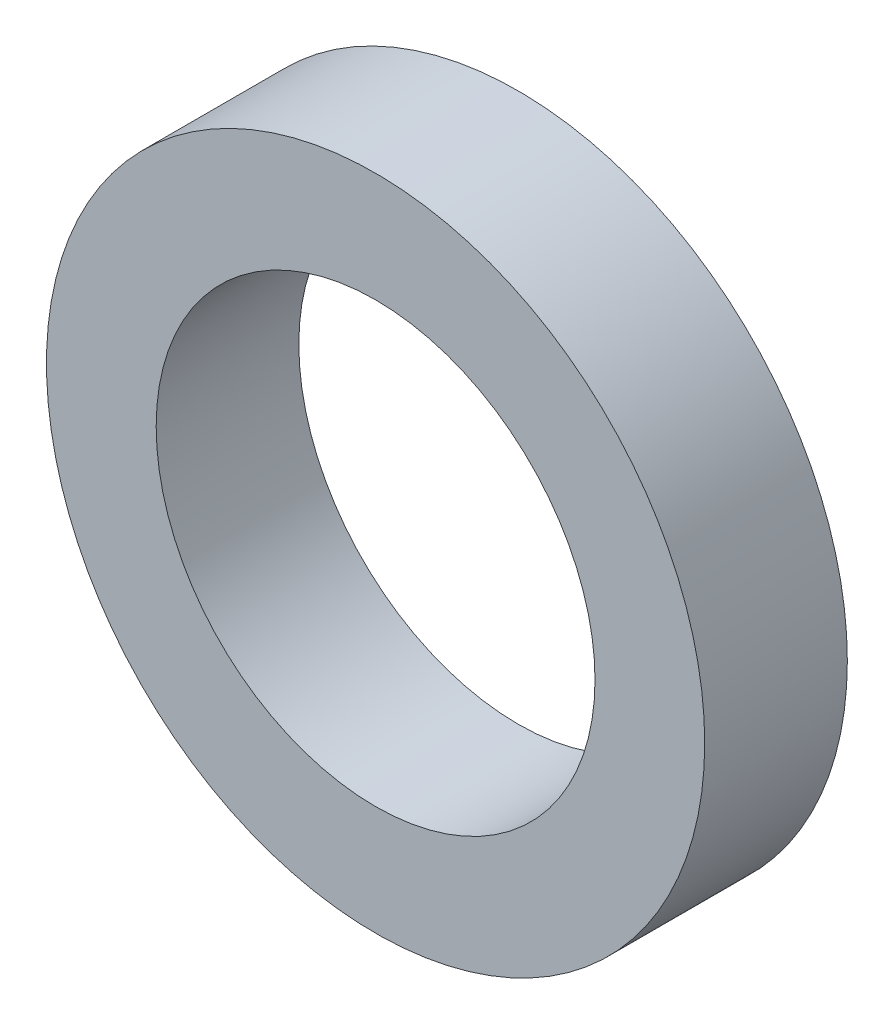
ISO-10303-21;
HEADER;
FILE_DESCRIPTION(('STEP AP214'),'2;1');
FILE_NAME('part.step','',(''),(''),'','','');
FILE_SCHEMA(('AUTOMOTIVE_DESIGN { 1 0 10303 214 1 1 1 1 }'));
ENDSEC;
DATA;
#1=APPLICATION_CONTEXT('core data for automotive mechanical design processes');
#2=APPLICATION_PROTOCOL_DEFINITION('international standard','automotive_design',2000,#1);
#3=PRODUCT_CONTEXT('',#1,'mechanical');
#4=PRODUCT('Part','Part','',(#3));
#5=PRODUCT_RELATED_PRODUCT_CATEGORY('part','',(#4));
#6=PRODUCT_DEFINITION_FORMATION('','',#4);
#7=PRODUCT_DEFINITION_CONTEXT('part definition',#1,'design');
#8=PRODUCT_DEFINITION('design','',#6,#7);
#9=PRODUCT_DEFINITION_SHAPE('','',#8);
#10=(LENGTH_UNIT() NAMED_UNIT(*) SI_UNIT(.MILLI.,.METRE.));
#11=(NAMED_UNIT(*) PLANE_ANGLE_UNIT() SI_UNIT($,.RADIAN.));
#12=(NAMED_UNIT(*) SI_UNIT($,.STERADIAN.) SOLID_ANGLE_UNIT());
#13=UNCERTAINTY_MEASURE_WITH_UNIT(LENGTH_MEASURE(1.E-05),#10,'distance_accuracy_value','');
#14=(GEOMETRIC_REPRESENTATION_CONTEXT(3) GLOBAL_UNCERTAINTY_ASSIGNED_CONTEXT((#13)) GLOBAL_UNIT_ASSIGNED_CONTEXT((#10,
#11,#12)) REPRESENTATION_CONTEXT('',''));
#15=CARTESIAN_POINT('',(0.,0.,0.));
#16=DIRECTION('',(0.,0.,1.));
#17=DIRECTION('',(1.,0.,0.));
#18=AXIS2_PLACEMENT_3D('',#15,#16,#17);
#19=CARTESIAN_POINT('',(0.,19.05,1.651));
#20=DIRECTION('',(0.,0.,-1.));
#21=DIRECTION('',(-1.,0.,0.));
#22=AXIS2_PLACEMENT_3D('',#19,#20,#21);
#23=CYLINDRICAL_SURFACE('',#22,2.54);
#24=CARTESIAN_POINT('',(0.,19.05,1.651));
#25=DIRECTION('',(0.,0.,1.));
#26=DIRECTION('',(1.,0.,0.));
#27=AXIS2_PLACEMENT_3D('',#24,#25,#26);
#28=CIRCLE('',#27,2.54);
#29=CARTESIAN_POINT('',(2.54,19.05,1.651));
#30=VERTEX_POINT('',#29);
#31=EDGE_CURVE('E22',#30,#30,#28,.T.);
#32=ORIENTED_EDGE('',*,*,#31,.T.);
#33=EDGE_LOOP('',(#32));
#34=FACE_BOUND('',#33,.T.);
#35=CARTESIAN_POINT('',(0.,19.05,0.));
#36=DIRECTION('',(0.,0.,1.));
#37=DIRECTION('',(1.,0.,0.));
#38=AXIS2_PLACEMENT_3D('',#35,#36,#37);
#39=CIRCLE('',#38,2.54);
#40=CARTESIAN_POINT('',(2.54,19.05,0.));
#41=VERTEX_POINT('',#40);
#42=EDGE_CURVE('E28',#41,#41,#39,.T.);
#43=ORIENTED_EDGE('',*,*,#42,.F.);
#44=EDGE_LOOP('',(#43));
#45=FACE_BOUND('',#44,.T.);
#46=ADVANCED_FACE('F15',(#34,#45),#23,.F.);
#47=CARTESIAN_POINT('',(0.,19.05,1.651));
#48=DIRECTION('',(0.,0.,-1.));
#49=DIRECTION('',(-1.,0.,0.));
#50=AXIS2_PLACEMENT_3D('',#47,#48,#49);
#51=CYLINDRICAL_SURFACE('',#50,3.81);
#52=CARTESIAN_POINT('',(0.,19.05,1.651));
#53=DIRECTION('',(0.,0.,1.));
#54=DIRECTION('',(1.,0.,0.));
#55=AXIS2_PLACEMENT_3D('',#52,#53,#54);
#56=CIRCLE('',#55,3.81);
#57=CARTESIAN_POINT('',(3.81,19.05,1.651));
#58=VERTEX_POINT('',#57);
#59=EDGE_CURVE('E10',#58,#58,#56,.T.);
#60=ORIENTED_EDGE('',*,*,#59,.F.);
#61=EDGE_LOOP('',(#60));
#62=FACE_BOUND('',#61,.T.);
#63=CARTESIAN_POINT('',(0.,19.05,0.));
#64=DIRECTION('',(0.,0.,1.));
#65=DIRECTION('',(1.,0.,0.));
#66=AXIS2_PLACEMENT_3D('',#63,#64,#65);
#67=CIRCLE('',#66,3.81);
#68=CARTESIAN_POINT('',(3.81,19.05,0.));
#69=VERTEX_POINT('',#68);
#70=EDGE_CURVE('E18',#69,#69,#67,.T.);
#71=ORIENTED_EDGE('',*,*,#70,.T.);
#72=EDGE_LOOP('',(#71));
#73=FACE_BOUND('',#72,.T.);
#74=ADVANCED_FACE('F35',(#62,#73),#51,.T.);
#75=CARTESIAN_POINT('',(0.,47.625,1.651));
#76=DIRECTION('',(0.,0.,1.));
#77=DIRECTION('',(1.,0.,0.));
#78=AXIS2_PLACEMENT_3D('',#75,#76,#77);
#79=PLANE('',#78);
#80=ORIENTED_EDGE('',*,*,#31,.F.);
#81=EDGE_LOOP('',(#80));
#82=FACE_BOUND('',#81,.T.);
#83=ORIENTED_EDGE('',*,*,#59,.T.);
#84=EDGE_LOOP('',(#83));
#85=FACE_BOUND('',#84,.T.);
#86=ADVANCED_FACE('F39',(#82,#85),#79,.T.);
#87=CARTESIAN_POINT('',(0.,47.625,0.));
#88=DIRECTION('',(0.,0.,1.));
#89=DIRECTION('',(1.,0.,0.));
#90=AXIS2_PLACEMENT_3D('',#87,#88,#89);
#91=PLANE('',#90);
#92=ORIENTED_EDGE('',*,*,#42,.T.);
#93=EDGE_LOOP('',(#92));
#94=FACE_BOUND('',#93,.T.);
#95=ORIENTED_EDGE('',*,*,#70,.F.);
#96=EDGE_LOOP('',(#95));
#97=FACE_BOUND('',#96,.T.);
#98=ADVANCED_FACE('F37',(#94,#97),#91,.F.);
#99=CLOSED_SHELL('',(#46,#74,#86,#98));
#100=MANIFOLD_SOLID_BREP('B1',#99);
#101=ADVANCED_BREP_SHAPE_REPRESENTATION('',(#18,#100),#14);
#102=SHAPE_DEFINITION_REPRESENTATION(#9,#101);
ENDSEC;
END-ISO-10303-21;
